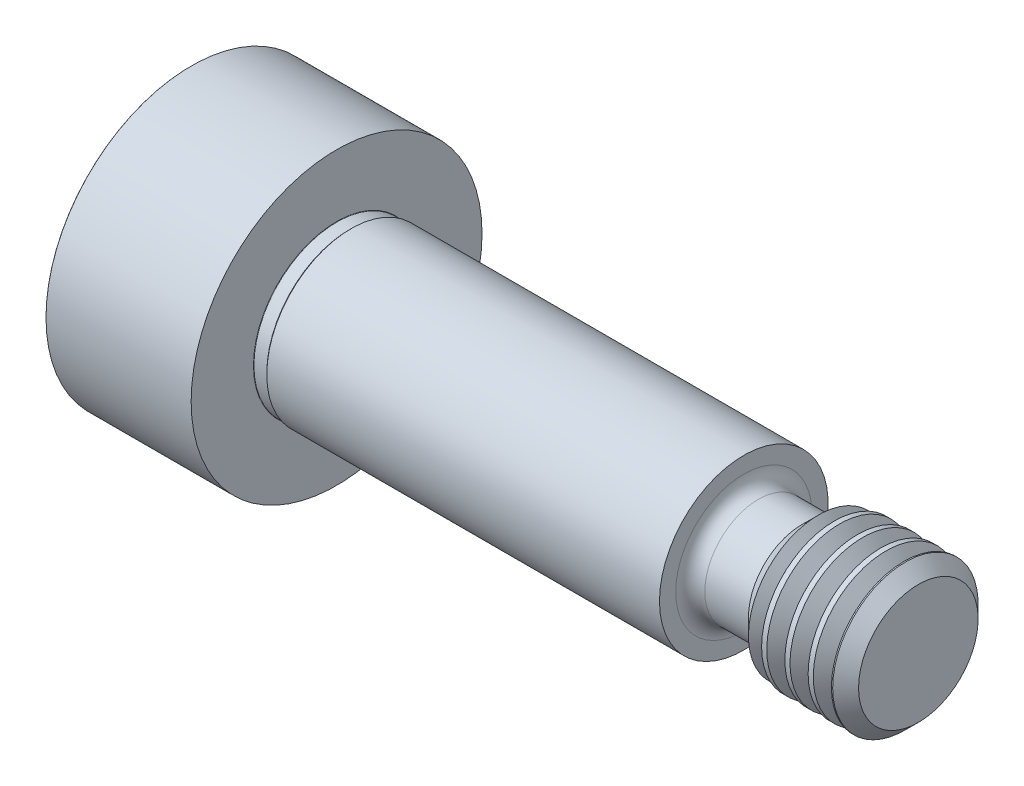
ISO-10303-21;
HEADER;
FILE_DESCRIPTION(('STEP AP214'),'2;1');
FILE_NAME('part.step','',(''),(''),'','','');
FILE_SCHEMA(('AUTOMOTIVE_DESIGN { 1 0 10303 214 1 1 1 1 }'));
ENDSEC;
DATA;
#1=APPLICATION_CONTEXT('core data for automotive mechanical design processes');
#2=APPLICATION_PROTOCOL_DEFINITION('international standard','automotive_design',2000,#1);
#3=PRODUCT_CONTEXT('',#1,'mechanical');
#4=PRODUCT('Part','Part','',(#3));
#5=PRODUCT_RELATED_PRODUCT_CATEGORY('part','',(#4));
#6=PRODUCT_DEFINITION_FORMATION('','',#4);
#7=PRODUCT_DEFINITION_CONTEXT('part definition',#1,'design');
#8=PRODUCT_DEFINITION('design','',#6,#7);
#9=PRODUCT_DEFINITION_SHAPE('','',#8);
#10=(LENGTH_UNIT() NAMED_UNIT(*) SI_UNIT(.MILLI.,.METRE.));
#11=(NAMED_UNIT(*) PLANE_ANGLE_UNIT() SI_UNIT($,.RADIAN.));
#12=(NAMED_UNIT(*) SI_UNIT($,.STERADIAN.) SOLID_ANGLE_UNIT());
#13=UNCERTAINTY_MEASURE_WITH_UNIT(LENGTH_MEASURE(1.E-05),#10,'distance_accuracy_value','');
#14=(GEOMETRIC_REPRESENTATION_CONTEXT(3) GLOBAL_UNCERTAINTY_ASSIGNED_CONTEXT((#13)) GLOBAL_UNIT_ASSIGNED_CONTEXT((#10,
#11,#12)) REPRESENTATION_CONTEXT('',''));
#15=CARTESIAN_POINT('',(0.,0.,0.));
#16=DIRECTION('',(0.,0.,1.));
#17=DIRECTION('',(1.,0.,0.));
#18=AXIS2_PLACEMENT_3D('',#15,#16,#17);
#19=CARTESIAN_POINT('',(0.,0.,0.));
#20=DIRECTION('',(-1.,0.,0.));
#21=DIRECTION('',(0.,0.,1.));
#22=AXIS2_PLACEMENT_3D('',#19,#20,#21);
#23=PLANE('',#22);
#24=CARTESIAN_POINT('',(0.,0.,0.));
#25=DIRECTION('',(-1.,0.,0.));
#26=DIRECTION('',(0.,0.,1.));
#27=AXIS2_PLACEMENT_3D('',#24,#25,#26);
#28=CIRCLE('',#27,4.99);
#29=CARTESIAN_POINT('',(0.,0.,4.99));
#30=VERTEX_POINT('',#29);
#31=EDGE_CURVE('E42',#30,#30,#28,.T.);
#32=ORIENTED_EDGE('',*,*,#31,.T.);
#33=EDGE_LOOP('',(#32));
#34=FACE_BOUND('',#33,.T.);
#35=DIRECTION('',(0.,-0.5,-0.866025403784439));
#36=VECTOR('',#35,1.);
#37=CARTESIAN_POINT('',(0.,-0.889119414552024,1.54));
#38=LINE('',#37,#36);
#39=CARTESIAN_POINT('',(0.,-0.889119414552024,1.54));
#40=VERTEX_POINT('',#39);
#41=CARTESIAN_POINT('',(0.,-1.77823882910405,0.));
#42=VERTEX_POINT('',#41);
#43=EDGE_CURVE('E50',#40,#42,#38,.T.);
#44=ORIENTED_EDGE('',*,*,#43,.T.);
#45=DIRECTION('',(0.,0.5,-0.866025403784439));
#46=VECTOR('',#45,1.);
#47=CARTESIAN_POINT('',(0.,-1.77823882910405,0.));
#48=LINE('',#47,#46);
#49=CARTESIAN_POINT('',(0.,-0.889119414552024,-1.54));
#50=VERTEX_POINT('',#49);
#51=EDGE_CURVE('E186',#42,#50,#48,.T.);
#52=ORIENTED_EDGE('',*,*,#51,.T.);
#53=DIRECTION('',(0.,1.,0.));
#54=VECTOR('',#53,1.);
#55=CARTESIAN_POINT('',(0.,-0.889119414552024,-1.54));
#56=LINE('',#55,#54);
#57=CARTESIAN_POINT('',(0.,0.889119414552017,-1.54));
#58=VERTEX_POINT('',#57);
#59=EDGE_CURVE('E130',#50,#58,#56,.T.);
#60=ORIENTED_EDGE('',*,*,#59,.T.);
#61=DIRECTION('',(0.,0.500000000000004,0.866025403784436));
#62=VECTOR('',#61,1.);
#63=CARTESIAN_POINT('',(0.,0.889119414552017,-1.54));
#64=LINE('',#63,#62);
#65=CARTESIAN_POINT('',(0.,1.77823882910405,0.));
#66=VERTEX_POINT('',#65);
#67=EDGE_CURVE('E235',#58,#66,#64,.T.);
#68=ORIENTED_EDGE('',*,*,#67,.T.);
#69=DIRECTION('',(0.,-0.500000000000004,0.866025403784436));
#70=VECTOR('',#69,1.);
#71=CARTESIAN_POINT('',(0.,1.77823882910405,0.));
#72=LINE('',#71,#70);
#73=CARTESIAN_POINT('',(0.,0.889119414552018,1.54));
#74=VERTEX_POINT('',#73);
#75=EDGE_CURVE('E237',#66,#74,#72,.T.);
#76=ORIENTED_EDGE('',*,*,#75,.T.);
#77=DIRECTION('',(0.,-1.,0.));
#78=VECTOR('',#77,1.);
#79=CARTESIAN_POINT('',(0.,0.889119414552018,1.54));
#80=LINE('',#79,#78);
#81=EDGE_CURVE('E239',#74,#40,#80,.T.);
#82=ORIENTED_EDGE('',*,*,#81,.T.);
#83=EDGE_LOOP('',(#44,#52,#60,#68,#76,#82));
#84=FACE_BOUND('',#83,.T.);
#85=ADVANCED_FACE('F33',(#34,#84),#23,.T.);
#86=CARTESIAN_POINT('',(-6.34999999999999,0.,0.));
#87=DIRECTION('',(-1.,0.,0.));
#88=DIRECTION('',(0.,0.,1.));
#89=AXIS2_PLACEMENT_3D('',#86,#87,#88);
#90=CYLINDRICAL_SURFACE('',#89,5.);
#91=CARTESIAN_POINT('',(0.00999999999999873,0.,0.));
#92=DIRECTION('',(-1.,0.,0.));
#93=DIRECTION('',(0.,0.,1.));
#94=AXIS2_PLACEMENT_3D('',#91,#92,#93);
#95=CIRCLE('',#94,5.);
#96=CARTESIAN_POINT('',(0.00999999999999873,0.,5.));
#97=VERTEX_POINT('',#96);
#98=EDGE_CURVE('E11',#97,#97,#95,.F.);
#99=ORIENTED_EDGE('',*,*,#98,.T.);
#100=EDGE_LOOP('',(#99));
#101=FACE_BOUND('',#100,.T.);
#102=CARTESIAN_POINT('',(5.,0.,0.));
#103=DIRECTION('',(-1.,0.,0.));
#104=DIRECTION('',(0.,0.,1.));
#105=AXIS2_PLACEMENT_3D('',#102,#103,#104);
#106=CIRCLE('',#105,5.);
#107=CARTESIAN_POINT('',(5.,0.,5.));
#108=VERTEX_POINT('',#107);
#109=EDGE_CURVE('E174',#108,#108,#106,.T.);
#110=ORIENTED_EDGE('',*,*,#109,.T.);
#111=EDGE_LOOP('',(#110));
#112=FACE_BOUND('',#111,.T.);
#113=ADVANCED_FACE('F298',(#101,#112),#90,.T.);
#114=CARTESIAN_POINT('',(5.,5.,0.));
#115=DIRECTION('',(1.,0.,0.));
#116=DIRECTION('',(0.,0.,-1.));
#117=AXIS2_PLACEMENT_3D('',#114,#115,#116);
#118=PLANE('',#117);
#119=CARTESIAN_POINT('',(5.,0.,0.));
#120=DIRECTION('',(-1.,0.,0.));
#121=DIRECTION('',(0.,0.,1.));
#122=AXIS2_PLACEMENT_3D('',#119,#120,#121);
#123=CIRCLE('',#122,2.86);
#124=CARTESIAN_POINT('',(5.,0.,2.86));
#125=VERTEX_POINT('',#124);
#126=EDGE_CURVE('E171',#125,#125,#123,.T.);
#127=ORIENTED_EDGE('',*,*,#126,.T.);
#128=EDGE_LOOP('',(#127));
#129=FACE_BOUND('',#128,.T.);
#130=ORIENTED_EDGE('',*,*,#109,.F.);
#131=EDGE_LOOP('',(#130));
#132=FACE_BOUND('',#131,.T.);
#133=ADVANCED_FACE('F303',(#129,#132),#118,.T.);
#134=CARTESIAN_POINT('',(5.01,0.,0.));
#135=DIRECTION('',(-1.,0.,0.));
#136=DIRECTION('',(0.,0.,1.));
#137=AXIS2_PLACEMENT_3D('',#134,#135,#136);
#138=TOROIDAL_SURFACE('',#137,2.86,0.01);
#139=ORIENTED_EDGE('',*,*,#126,.F.);
#140=EDGE_LOOP('',(#139));
#141=FACE_BOUND('',#140,.T.);
#142=CARTESIAN_POINT('',(5.01,0.,0.));
#143=DIRECTION('',(-1.,0.,0.));
#144=DIRECTION('',(0.,0.,1.));
#145=AXIS2_PLACEMENT_3D('',#142,#143,#144);
#146=CIRCLE('',#145,2.85);
#147=CARTESIAN_POINT('',(5.01,0.,2.85));
#148=VERTEX_POINT('',#147);
#149=EDGE_CURVE('E168',#148,#148,#146,.T.);
#150=ORIENTED_EDGE('',*,*,#149,.T.);
#151=EDGE_LOOP('',(#150));
#152=FACE_BOUND('',#151,.T.);
#153=ADVANCED_FACE('F309',(#141,#152),#138,.F.);
#154=CARTESIAN_POINT('',(-6.34999999999999,0.,0.));
#155=DIRECTION('',(-1.,0.,0.));
#156=DIRECTION('',(0.,0.,1.));
#157=AXIS2_PLACEMENT_3D('',#154,#155,#156);
#158=CYLINDRICAL_SURFACE('',#157,2.85);
#159=CARTESIAN_POINT('',(5.45,0.,0.));
#160=DIRECTION('',(-1.,0.,0.));
#161=DIRECTION('',(0.,0.,1.));
#162=AXIS2_PLACEMENT_3D('',#159,#160,#161);
#163=CIRCLE('',#162,2.85);
#164=CARTESIAN_POINT('',(5.45,0.,2.85));
#165=VERTEX_POINT('',#164);
#166=EDGE_CURVE('E165',#165,#165,#163,.T.);
#167=ORIENTED_EDGE('',*,*,#166,.T.);
#168=EDGE_LOOP('',(#167));
#169=FACE_BOUND('',#168,.T.);
#170=ORIENTED_EDGE('',*,*,#149,.F.);
#171=EDGE_LOOP('',(#170));
#172=FACE_BOUND('',#171,.T.);
#173=ADVANCED_FACE('F313',(#169,#172),#158,.T.);
#174=CARTESIAN_POINT('',(5.45,0.,0.));
#175=DIRECTION('',(1.,0.,0.));
#176=DIRECTION('',(0.,0.,-1.));
#177=AXIS2_PLACEMENT_3D('',#174,#175,#176);
#178=CONICAL_SURFACE('',#177,2.85,0.785398163397448);
#179=CARTESIAN_POINT('',(5.5,0.,0.));
#180=DIRECTION('',(-1.,0.,0.));
#181=DIRECTION('',(0.,0.,1.));
#182=AXIS2_PLACEMENT_3D('',#179,#180,#181);
#183=CIRCLE('',#182,2.9);
#184=CARTESIAN_POINT('',(5.5,0.,2.9));
#185=VERTEX_POINT('',#184);
#186=EDGE_CURVE('E162',#185,#185,#183,.T.);
#187=ORIENTED_EDGE('',*,*,#186,.T.);
#188=EDGE_LOOP('',(#187));
#189=FACE_BOUND('',#188,.T.);
#190=ORIENTED_EDGE('',*,*,#166,.F.);
#191=EDGE_LOOP('',(#190));
#192=FACE_BOUND('',#191,.T.);
#193=ADVANCED_FACE('F317',(#189,#192),#178,.T.);
#194=CARTESIAN_POINT('',(-6.34999999999999,0.,0.));
#195=DIRECTION('',(-1.,0.,0.));
#196=DIRECTION('',(0.,0.,1.));
#197=AXIS2_PLACEMENT_3D('',#194,#195,#196);
#198=CYLINDRICAL_SURFACE('',#197,2.9);
#199=CARTESIAN_POINT('',(19.,0.,0.));
#200=DIRECTION('',(-1.,0.,0.));
#201=DIRECTION('',(0.,0.,1.));
#202=AXIS2_PLACEMENT_3D('',#199,#200,#201);
#203=CIRCLE('',#202,2.9);
#204=CARTESIAN_POINT('',(19.,0.,2.9));
#205=VERTEX_POINT('',#204);
#206=EDGE_CURVE('E159',#205,#205,#203,.T.);
#207=ORIENTED_EDGE('',*,*,#206,.T.);
#208=EDGE_LOOP('',(#207));
#209=FACE_BOUND('',#208,.T.);
#210=ORIENTED_EDGE('',*,*,#186,.F.);
#211=EDGE_LOOP('',(#210));
#212=FACE_BOUND('',#211,.T.);
#213=ADVANCED_FACE('F321',(#209,#212),#198,.T.);
#214=CARTESIAN_POINT('',(19.,2.9,0.));
#215=DIRECTION('',(1.,0.,0.));
#216=DIRECTION('',(0.,0.,-1.));
#217=AXIS2_PLACEMENT_3D('',#214,#215,#216);
#218=PLANE('',#217);
#219=CARTESIAN_POINT('',(19.,0.,0.));
#220=DIRECTION('',(-1.,0.,0.));
#221=DIRECTION('',(0.,0.,1.));
#222=AXIS2_PLACEMENT_3D('',#219,#220,#221);
#223=CIRCLE('',#222,2.34);
#224=CARTESIAN_POINT('',(19.,0.,2.34));
#225=VERTEX_POINT('',#224);
#226=EDGE_CURVE('E156',#225,#225,#223,.T.);
#227=ORIENTED_EDGE('',*,*,#226,.T.);
#228=EDGE_LOOP('',(#227));
#229=FACE_BOUND('',#228,.T.);
#230=ORIENTED_EDGE('',*,*,#206,.F.);
#231=EDGE_LOOP('',(#230));
#232=FACE_BOUND('',#231,.T.);
#233=ADVANCED_FACE('F325',(#229,#232),#218,.T.);
#234=CARTESIAN_POINT('',(19.5,0.,0.));
#235=DIRECTION('',(-1.,0.,0.));
#236=DIRECTION('',(0.,0.,1.));
#237=AXIS2_PLACEMENT_3D('',#234,#235,#236);
#238=TOROIDAL_SURFACE('',#237,2.34,0.500000000000002);
#239=CARTESIAN_POINT('',(19.5,0.,0.));
#240=DIRECTION('',(-1.,0.,0.));
#241=DIRECTION('',(0.,0.,1.));
#242=AXIS2_PLACEMENT_3D('',#239,#240,#241);
#243=CIRCLE('',#242,1.84);
#244=CARTESIAN_POINT('',(19.5,0.,1.84));
#245=VERTEX_POINT('',#244);
#246=EDGE_CURVE('E153',#245,#245,#243,.T.);
#247=ORIENTED_EDGE('',*,*,#246,.T.);
#248=EDGE_LOOP('',(#247));
#249=FACE_BOUND('',#248,.T.);
#250=ORIENTED_EDGE('',*,*,#226,.F.);
#251=EDGE_LOOP('',(#250));
#252=FACE_BOUND('',#251,.T.);
#253=ADVANCED_FACE('F329',(#249,#252),#238,.F.);
#254=CARTESIAN_POINT('',(-6.34999999999999,0.,0.));
#255=DIRECTION('',(-1.,0.,0.));
#256=DIRECTION('',(0.,0.,1.));
#257=AXIS2_PLACEMENT_3D('',#254,#255,#256);
#258=CYLINDRICAL_SURFACE('',#257,1.84);
#259=CARTESIAN_POINT('',(21.,0.,0.));
#260=DIRECTION('',(-1.,0.,0.));
#261=DIRECTION('',(0.,0.,1.));
#262=AXIS2_PLACEMENT_3D('',#259,#260,#261);
#263=CIRCLE('',#262,1.84);
#264=CARTESIAN_POINT('',(21.,0.,1.84));
#265=VERTEX_POINT('',#264);
#266=EDGE_CURVE('E150',#265,#265,#263,.T.);
#267=ORIENTED_EDGE('',*,*,#266,.T.);
#268=EDGE_LOOP('',(#267));
#269=FACE_BOUND('',#268,.T.);
#270=ORIENTED_EDGE('',*,*,#246,.F.);
#271=EDGE_LOOP('',(#270));
#272=FACE_BOUND('',#271,.T.);
#273=ADVANCED_FACE('F333',(#269,#272),#258,.T.);
#274=CARTESIAN_POINT('',(21.,0.,0.));
#275=DIRECTION('',(1.,0.,0.));
#276=DIRECTION('',(0.,0.,-1.));
#277=AXIS2_PLACEMENT_3D('',#274,#275,#276);
#278=CONICAL_SURFACE('',#277,1.84,0.785398163397448);
#279=CARTESIAN_POINT('',(21.5590756418572,0.,0.));
#280=DIRECTION('',(-1.,0.,0.));
#281=DIRECTION('',(0.,-1.,0.));
#282=AXIS2_PLACEMENT_3D('',#279,#280,#281);
#283=CIRCLE('',#282,2.39907564185722);
#284=CARTESIAN_POINT('',(21.5590756418572,-2.39907564185722,0.));
#285=VERTEX_POINT('',#284);
#286=EDGE_CURVE('E182',#285,#285,#283,.F.);
#287=ORIENTED_EDGE('',*,*,#286,.F.);
#288=EDGE_LOOP('',(#287));
#289=FACE_BOUND('',#288,.T.);
#290=ORIENTED_EDGE('',*,*,#266,.F.);
#291=EDGE_LOOP('',(#290));
#292=FACE_BOUND('',#291,.T.);
#293=ADVANCED_FACE('F337',(#289,#292),#278,.T.);
#294=CARTESIAN_POINT('',(0.,0.,0.));
#295=DIRECTION('',(1.,0.,0.));
#296=DIRECTION('',(0.,0.,-1.));
#297=AXIS2_PLACEMENT_3D('',#294,#295,#296);
#298=CONICAL_SURFACE('',#297,4.99,0.785398163397492);
#299=ORIENTED_EDGE('',*,*,#98,.F.);
#300=EDGE_LOOP('',(#299));
#301=FACE_BOUND('',#300,.T.);
#302=ORIENTED_EDGE('',*,*,#31,.F.);
#303=EDGE_LOOP('',(#302));
#304=FACE_BOUND('',#303,.T.);
#305=ADVANCED_FACE('F35',(#301,#304),#298,.T.);
#306=CARTESIAN_POINT('',(2.4,-1.77823882910405,0.));
#307=DIRECTION('',(0.,0.866025403784439,0.5));
#308=DIRECTION('',(0.,-0.5,0.866025403784439));
#309=AXIS2_PLACEMENT_3D('',#306,#307,#308);
#310=PLANE('',#309);
#311=DIRECTION('',(0.,0.5,-0.866025403784439));
#312=VECTOR('',#311,1.);
#313=CARTESIAN_POINT('',(2.4,-1.77823882910405,0.));
#314=LINE('',#313,#312);
#315=CARTESIAN_POINT('',(2.4,-1.77823882910405,0.));
#316=VERTEX_POINT('',#315);
#317=CARTESIAN_POINT('',(2.4,-1.33367912182803,-0.769999999999998));
#318=VERTEX_POINT('',#317);
#319=EDGE_CURVE('E58',#316,#318,#314,.T.);
#320=ORIENTED_EDGE('',*,*,#319,.T.);
#321=CARTESIAN_POINT('',(2.4,-0.889119414552024,-1.54));
#322=VERTEX_POINT('',#321);
#323=EDGE_CURVE('E108',#318,#322,#314,.T.);
#324=ORIENTED_EDGE('',*,*,#323,.T.);
#325=DIRECTION('',(-1.,0.,0.));
#326=VECTOR('',#325,1.);
#327=CARTESIAN_POINT('',(2.4,-0.889119414552024,-1.54));
#328=LINE('',#327,#326);
#329=EDGE_CURVE('E112',#322,#50,#328,.T.);
#330=ORIENTED_EDGE('',*,*,#329,.T.);
#331=ORIENTED_EDGE('',*,*,#51,.F.);
#332=DIRECTION('',(-1.,0.,0.));
#333=VECTOR('',#332,1.);
#334=CARTESIAN_POINT('',(2.4,-1.77823882910405,0.));
#335=LINE('',#334,#333);
#336=EDGE_CURVE('E232',#316,#42,#335,.T.);
#337=ORIENTED_EDGE('',*,*,#336,.F.);
#338=EDGE_LOOP('',(#320,#324,#330,#331,#337));
#339=FACE_BOUND('',#338,.T.);
#340=ADVANCED_FACE('F110',(#339),#310,.T.);
#341=CARTESIAN_POINT('',(2.4,-0.889119414552024,-1.54));
#342=DIRECTION('',(0.,0.,1.));
#343=DIRECTION('',(0.,-1.,0.));
#344=AXIS2_PLACEMENT_3D('',#341,#342,#343);
#345=PLANE('',#344);
#346=DIRECTION('',(0.,1.,0.));
#347=VECTOR('',#346,1.);
#348=CARTESIAN_POINT('',(2.4,-0.889119414552024,-1.54));
#349=LINE('',#348,#347);
#350=CARTESIAN_POINT('',(2.4,0.,-1.54));
#351=VERTEX_POINT('',#350);
#352=EDGE_CURVE('E117',#322,#351,#349,.T.);
#353=ORIENTED_EDGE('',*,*,#352,.T.);
#354=CARTESIAN_POINT('',(2.4,0.889119414552017,-1.54));
#355=VERTEX_POINT('',#354);
#356=EDGE_CURVE('E125',#351,#355,#349,.T.);
#357=ORIENTED_EDGE('',*,*,#356,.T.);
#358=DIRECTION('',(-1.,0.,0.));
#359=VECTOR('',#358,1.);
#360=CARTESIAN_POINT('',(2.4,0.889119414552017,-1.54));
#361=LINE('',#360,#359);
#362=EDGE_CURVE('E132',#355,#58,#361,.T.);
#363=ORIENTED_EDGE('',*,*,#362,.T.);
#364=ORIENTED_EDGE('',*,*,#59,.F.);
#365=ORIENTED_EDGE('',*,*,#329,.F.);
#366=EDGE_LOOP('',(#353,#357,#363,#364,#365));
#367=FACE_BOUND('',#366,.T.);
#368=ADVANCED_FACE('F128',(#367),#345,.T.);
#369=CARTESIAN_POINT('',(2.4,0.889119414552017,-1.54));
#370=DIRECTION('',(0.,-0.866025403784436,0.500000000000004));
#371=DIRECTION('',(0.,-0.500000000000004,-0.866025403784437));
#372=AXIS2_PLACEMENT_3D('',#369,#370,#371);
#373=PLANE('',#372);
#374=DIRECTION('',(0.,0.500000000000004,0.866025403784436));
#375=VECTOR('',#374,1.);
#376=CARTESIAN_POINT('',(2.4,0.889119414552017,-1.54));
#377=LINE('',#376,#375);
#378=CARTESIAN_POINT('',(2.4,1.33367912182803,-0.770000000000004));
#379=VERTEX_POINT('',#378);
#380=EDGE_CURVE('E217',#355,#379,#377,.T.);
#381=ORIENTED_EDGE('',*,*,#380,.T.);
#382=CARTESIAN_POINT('',(2.4,1.77823882910405,0.));
#383=VERTEX_POINT('',#382);
#384=EDGE_CURVE('E124',#379,#383,#377,.T.);
#385=ORIENTED_EDGE('',*,*,#384,.T.);
#386=DIRECTION('',(-1.,0.,0.));
#387=VECTOR('',#386,1.);
#388=CARTESIAN_POINT('',(2.4,1.77823882910405,0.));
#389=LINE('',#388,#387);
#390=EDGE_CURVE('E138',#383,#66,#389,.T.);
#391=ORIENTED_EDGE('',*,*,#390,.T.);
#392=ORIENTED_EDGE('',*,*,#67,.F.);
#393=ORIENTED_EDGE('',*,*,#362,.F.);
#394=EDGE_LOOP('',(#381,#385,#391,#392,#393));
#395=FACE_BOUND('',#394,.T.);
#396=ADVANCED_FACE('F254',(#395),#373,.T.);
#397=CARTESIAN_POINT('',(2.4,1.77823882910405,0.));
#398=DIRECTION('',(0.,-0.866025403784437,-0.500000000000004));
#399=DIRECTION('',(0.,0.500000000000004,-0.866025403784436));
#400=AXIS2_PLACEMENT_3D('',#397,#398,#399);
#401=PLANE('',#400);
#402=DIRECTION('',(0.,-0.500000000000004,0.866025403784436));
#403=VECTOR('',#402,1.);
#404=CARTESIAN_POINT('',(2.4,1.77823882910405,0.));
#405=LINE('',#404,#403);
#406=CARTESIAN_POINT('',(2.4,1.33367912182803,0.770000000000004));
#407=VERTEX_POINT('',#406);
#408=EDGE_CURVE('E221',#383,#407,#405,.T.);
#409=ORIENTED_EDGE('',*,*,#408,.T.);
#410=CARTESIAN_POINT('',(2.4,0.889119414552018,1.54));
#411=VERTEX_POINT('',#410);
#412=EDGE_CURVE('E220',#407,#411,#405,.T.);
#413=ORIENTED_EDGE('',*,*,#412,.T.);
#414=DIRECTION('',(-1.,0.,0.));
#415=VECTOR('',#414,1.);
#416=CARTESIAN_POINT('',(2.4,0.889119414552018,1.54));
#417=LINE('',#416,#415);
#418=EDGE_CURVE('E247',#411,#74,#417,.T.);
#419=ORIENTED_EDGE('',*,*,#418,.T.);
#420=ORIENTED_EDGE('',*,*,#75,.F.);
#421=ORIENTED_EDGE('',*,*,#390,.F.);
#422=EDGE_LOOP('',(#409,#413,#419,#420,#421));
#423=FACE_BOUND('',#422,.T.);
#424=ADVANCED_FACE('F259',(#423),#401,.T.);
#425=CARTESIAN_POINT('',(2.4,0.889119414552018,1.54));
#426=DIRECTION('',(0.,0.,-1.));
#427=DIRECTION('',(0.,1.,0.));
#428=AXIS2_PLACEMENT_3D('',#425,#426,#427);
#429=PLANE('',#428);
#430=DIRECTION('',(0.,-1.,0.));
#431=VECTOR('',#430,1.);
#432=CARTESIAN_POINT('',(2.4,0.889119414552018,1.54));
#433=LINE('',#432,#431);
#434=CARTESIAN_POINT('',(2.4,0.,1.54));
#435=VERTEX_POINT('',#434);
#436=EDGE_CURVE('E225',#411,#435,#433,.T.);
#437=ORIENTED_EDGE('',*,*,#436,.T.);
#438=CARTESIAN_POINT('',(2.4,-0.889119414552024,1.54));
#439=VERTEX_POINT('',#438);
#440=EDGE_CURVE('E224',#435,#439,#433,.T.);
#441=ORIENTED_EDGE('',*,*,#440,.T.);
#442=DIRECTION('',(-1.,0.,0.));
#443=VECTOR('',#442,1.);
#444=CARTESIAN_POINT('',(2.4,-0.889119414552024,1.54));
#445=LINE('',#444,#443);
#446=EDGE_CURVE('E244',#439,#40,#445,.T.);
#447=ORIENTED_EDGE('',*,*,#446,.T.);
#448=ORIENTED_EDGE('',*,*,#81,.F.);
#449=ORIENTED_EDGE('',*,*,#418,.F.);
#450=EDGE_LOOP('',(#437,#441,#447,#448,#449));
#451=FACE_BOUND('',#450,.T.);
#452=ADVANCED_FACE('F284',(#451),#429,.T.);
#453=CARTESIAN_POINT('',(2.4,-0.889119414552024,1.54));
#454=DIRECTION('',(0.,0.866025403784439,-0.5));
#455=DIRECTION('',(0.,0.5,0.866025403784439));
#456=AXIS2_PLACEMENT_3D('',#453,#454,#455);
#457=PLANE('',#456);
#458=DIRECTION('',(0.,-0.5,-0.866025403784439));
#459=VECTOR('',#458,1.);
#460=CARTESIAN_POINT('',(2.4,-0.889119414552024,1.54));
#461=LINE('',#460,#459);
#462=CARTESIAN_POINT('',(2.4,-1.33367912182804,0.77));
#463=VERTEX_POINT('',#462);
#464=EDGE_CURVE('E229',#439,#463,#461,.T.);
#465=ORIENTED_EDGE('',*,*,#464,.T.);
#466=EDGE_CURVE('E228',#463,#316,#461,.T.);
#467=ORIENTED_EDGE('',*,*,#466,.T.);
#468=ORIENTED_EDGE('',*,*,#336,.T.);
#469=ORIENTED_EDGE('',*,*,#43,.F.);
#470=ORIENTED_EDGE('',*,*,#446,.F.);
#471=EDGE_LOOP('',(#465,#467,#468,#469,#470));
#472=FACE_BOUND('',#471,.T.);
#473=ADVANCED_FACE('F286',(#472),#457,.T.);
#474=CARTESIAN_POINT('',(2.4,0.,-3.07999999999999));
#475=DIRECTION('',(1.,0.,0.));
#476=DIRECTION('',(0.,0.,-1.));
#477=AXIS2_PLACEMENT_3D('',#474,#475,#476);
#478=PLANE('',#477);
#479=CARTESIAN_POINT('',(2.4,0.,0.));
#480=DIRECTION('',(-1.,0.,0.));
#481=DIRECTION('',(0.,0.,1.));
#482=AXIS2_PLACEMENT_3D('',#479,#480,#481);
#483=CIRCLE('',#482,1.54);
#484=EDGE_CURVE('E266',#379,#351,#483,.T.);
#485=ORIENTED_EDGE('',*,*,#484,.F.);
#486=ORIENTED_EDGE('',*,*,#380,.F.);
#487=ORIENTED_EDGE('',*,*,#356,.F.);
#488=EDGE_LOOP('',(#485,#486,#487));
#489=FACE_BOUND('',#488,.T.);
#490=ADVANCED_FACE('F265',(#489),#478,.F.);
#491=EDGE_CURVE('E144',#407,#379,#483,.T.);
#492=ORIENTED_EDGE('',*,*,#491,.F.);
#493=ORIENTED_EDGE('',*,*,#408,.F.);
#494=ORIENTED_EDGE('',*,*,#384,.F.);
#495=EDGE_LOOP('',(#492,#493,#494));
#496=FACE_BOUND('',#495,.T.);
#497=ADVANCED_FACE('F269',(#496),#478,.F.);
#498=EDGE_CURVE('E137',#435,#407,#483,.T.);
#499=ORIENTED_EDGE('',*,*,#498,.F.);
#500=ORIENTED_EDGE('',*,*,#436,.F.);
#501=ORIENTED_EDGE('',*,*,#412,.F.);
#502=EDGE_LOOP('',(#499,#500,#501));
#503=FACE_BOUND('',#502,.T.);
#504=ADVANCED_FACE('F277',(#503),#478,.F.);
#505=EDGE_CURVE('E131',#463,#435,#483,.T.);
#506=ORIENTED_EDGE('',*,*,#505,.F.);
#507=ORIENTED_EDGE('',*,*,#464,.F.);
#508=ORIENTED_EDGE('',*,*,#440,.F.);
#509=EDGE_LOOP('',(#506,#507,#508));
#510=FACE_BOUND('',#509,.T.);
#511=ADVANCED_FACE('F280',(#510),#478,.F.);
#512=EDGE_CURVE('E135',#318,#463,#483,.T.);
#513=ORIENTED_EDGE('',*,*,#512,.F.);
#514=ORIENTED_EDGE('',*,*,#319,.F.);
#515=ORIENTED_EDGE('',*,*,#466,.F.);
#516=EDGE_LOOP('',(#513,#514,#515));
#517=FACE_BOUND('',#516,.T.);
#518=ADVANCED_FACE('F288',(#517),#478,.F.);
#519=EDGE_CURVE('E120',#351,#318,#483,.T.);
#520=ORIENTED_EDGE('',*,*,#519,.F.);
#521=ORIENTED_EDGE('',*,*,#352,.F.);
#522=ORIENTED_EDGE('',*,*,#323,.F.);
#523=EDGE_LOOP('',(#520,#521,#522));
#524=FACE_BOUND('',#523,.T.);
#525=ADVANCED_FACE('F118',(#524),#478,.F.);
#526=CARTESIAN_POINT('',(3.28911941455203,0.,0.));
#527=DIRECTION('',(-1.,0.,0.));
#528=DIRECTION('',(0.,0.,1.));
#529=AXIS2_PLACEMENT_3D('',#526,#527,#528);
#530=CONICAL_SURFACE('',#529,0.,1.04719755119659);
#531=ORIENTED_EDGE('',*,*,#498,.T.);
#532=ORIENTED_EDGE('',*,*,#491,.T.);
#533=ORIENTED_EDGE('',*,*,#484,.T.);
#534=ORIENTED_EDGE('',*,*,#519,.T.);
#535=ORIENTED_EDGE('',*,*,#512,.T.);
#536=ORIENTED_EDGE('',*,*,#505,.T.);
#537=EDGE_LOOP('',(#531,#532,#533,#534,#535,#536));
#538=FACE_BOUND('',#537,.T.);
#539=CARTESIAN_POINT('',(3.28911941455203,0.,0.));
#540=VERTEX_POINT('',#539);
#541=VERTEX_LOOP('',#540);
#542=FACE_BOUND('',#541,.T.);
#543=ADVANCED_FACE('F271',(#538,#542),#530,.F.);
#544=CARTESIAN_POINT('',(22.3916753697872,0.,0.));
#545=DIRECTION('',(1.,0.,0.));
#546=DIRECTION('',(0.,1.,0.));
#547=AXIS2_PLACEMENT_3D('',#544,#545,#546);
#548=CONICAL_SURFACE('',#547,2.9,0.959931088596884);
#549=CARTESIAN_POINT('',(22.1115923545033,0.,0.));
#550=DIRECTION('',(1.,0.,0.));
#551=DIRECTION('',(0.,1.,0.));
#552=AXIS2_PLACEMENT_3D('',#549,#550,#551);
#553=CIRCLE('',#552,2.5);
#554=CARTESIAN_POINT('',(22.1115923545033,2.5,0.));
#555=VERTEX_POINT('',#554);
#556=EDGE_CURVE('E179',#555,#555,#553,.F.);
#557=ORIENTED_EDGE('',*,*,#556,.T.);
#558=EDGE_LOOP('',(#557));
#559=FACE_BOUND('',#558,.T.);
#560=CARTESIAN_POINT('',(21.8,0.,0.));
#561=DIRECTION('',(-1.,0.,0.));
#562=DIRECTION('',(0.,-1.,0.));
#563=AXIS2_PLACEMENT_3D('',#560,#561,#562);
#564=CIRCLE('',#563,2.055);
#565=CARTESIAN_POINT('',(21.8,-2.055,0.));
#566=VERTEX_POINT('',#565);
#567=EDGE_CURVE('E183',#566,#566,#564,.T.);
#568=ORIENTED_EDGE('',*,*,#567,.F.);
#569=EDGE_LOOP('',(#568));
#570=FACE_BOUND('',#569,.T.);
#571=ADVANCED_FACE('F361',(#559,#570),#548,.T.);
#572=CARTESIAN_POINT('',(21.8,0.,0.));
#573=DIRECTION('',(-1.,0.,0.));
#574=DIRECTION('',(0.,-1.,0.));
#575=AXIS2_PLACEMENT_3D('',#572,#573,#574);
#576=CONICAL_SURFACE('',#575,2.055,0.959931088596873);
#577=ORIENTED_EDGE('',*,*,#286,.T.);
#578=EDGE_LOOP('',(#577));
#579=FACE_BOUND('',#578,.T.);
#580=ORIENTED_EDGE('',*,*,#567,.T.);
#581=EDGE_LOOP('',(#580));
#582=FACE_BOUND('',#581,.T.);
#583=ADVANCED_FACE('F346',(#579,#582),#576,.T.);
#584=CARTESIAN_POINT('',(-6.34999999999999,0.,0.));
#585=DIRECTION('',(-1.,0.,0.));
#586=DIRECTION('',(0.,0.,1.));
#587=AXIS2_PLACEMENT_3D('',#584,#585,#586);
#588=CYLINDRICAL_SURFACE('',#587,2.5);
#589=CARTESIAN_POINT('',(22.2884076454967,0.,0.));
#590=DIRECTION('',(-1.,0.,0.));
#591=DIRECTION('',(0.,-1.,0.));
#592=AXIS2_PLACEMENT_3D('',#589,#590,#591);
#593=CIRCLE('',#592,2.5);
#594=CARTESIAN_POINT('',(22.2884076454967,-2.5,0.));
#595=VERTEX_POINT('',#594);
#596=EDGE_CURVE('E187',#595,#595,#593,.F.);
#597=ORIENTED_EDGE('',*,*,#596,.F.);
#598=EDGE_LOOP('',(#597));
#599=FACE_BOUND('',#598,.T.);
#600=ORIENTED_EDGE('',*,*,#556,.F.);
#601=EDGE_LOOP('',(#600));
#602=FACE_BOUND('',#601,.T.);
#603=ADVANCED_FACE('F342',(#599,#602),#588,.T.);
#604=CARTESIAN_POINT('',(23.1916753697872,0.,0.));
#605=DIRECTION('',(1.,0.,0.));
#606=DIRECTION('',(0.,1.,0.));
#607=AXIS2_PLACEMENT_3D('',#604,#605,#606);
#608=CONICAL_SURFACE('',#607,2.9,0.959931088596884);
#609=CARTESIAN_POINT('',(22.9115923545033,0.,0.));
#610=DIRECTION('',(1.,0.,0.));
#611=DIRECTION('',(0.,1.,0.));
#612=AXIS2_PLACEMENT_3D('',#609,#610,#611);
#613=CIRCLE('',#612,2.5);
#614=CARTESIAN_POINT('',(22.9115923545033,2.5,0.));
#615=VERTEX_POINT('',#614);
#616=EDGE_CURVE('E190',#615,#615,#613,.F.);
#617=ORIENTED_EDGE('',*,*,#616,.T.);
#618=EDGE_LOOP('',(#617));
#619=FACE_BOUND('',#618,.T.);
#620=CARTESIAN_POINT('',(22.6,0.,0.));
#621=DIRECTION('',(-1.,0.,0.));
#622=DIRECTION('',(0.,-1.,0.));
#623=AXIS2_PLACEMENT_3D('',#620,#621,#622);
#624=CIRCLE('',#623,2.055);
#625=CARTESIAN_POINT('',(22.6,-2.055,0.));
#626=VERTEX_POINT('',#625);
#627=EDGE_CURVE('E191',#626,#626,#624,.T.);
#628=ORIENTED_EDGE('',*,*,#627,.F.);
#629=EDGE_LOOP('',(#628));
#630=FACE_BOUND('',#629,.T.);
#631=ADVANCED_FACE('F345',(#619,#630),#608,.T.);
#632=CARTESIAN_POINT('',(22.6,0.,0.));
#633=DIRECTION('',(-1.,0.,0.));
#634=DIRECTION('',(0.,-1.,0.));
#635=AXIS2_PLACEMENT_3D('',#632,#633,#634);
#636=CONICAL_SURFACE('',#635,2.055,0.959931088596873);
#637=ORIENTED_EDGE('',*,*,#596,.T.);
#638=EDGE_LOOP('',(#637));
#639=FACE_BOUND('',#638,.T.);
#640=ORIENTED_EDGE('',*,*,#627,.T.);
#641=EDGE_LOOP('',(#640));
#642=FACE_BOUND('',#641,.T.);
#643=ADVANCED_FACE('F447',(#639,#642),#636,.T.);
#644=CARTESIAN_POINT('',(23.0884076454967,0.,0.));
#645=DIRECTION('',(-1.,0.,0.));
#646=DIRECTION('',(0.,-1.,0.));
#647=AXIS2_PLACEMENT_3D('',#644,#645,#646);
#648=CIRCLE('',#647,2.5);
#649=CARTESIAN_POINT('',(23.0884076454967,-2.5,0.));
#650=VERTEX_POINT('',#649);
#651=EDGE_CURVE('E194',#650,#650,#648,.F.);
#652=ORIENTED_EDGE('',*,*,#651,.F.);
#653=EDGE_LOOP('',(#652));
#654=FACE_BOUND('',#653,.T.);
#655=ORIENTED_EDGE('',*,*,#616,.F.);
#656=EDGE_LOOP('',(#655));
#657=FACE_BOUND('',#656,.T.);
#658=ADVANCED_FACE('F349',(#654,#657),#588,.T.);
#659=CARTESIAN_POINT('',(23.9916753697872,0.,0.));
#660=DIRECTION('',(1.,0.,0.));
#661=DIRECTION('',(0.,1.,0.));
#662=AXIS2_PLACEMENT_3D('',#659,#660,#661);
#663=CONICAL_SURFACE('',#662,2.9,0.959931088596884);
#664=CARTESIAN_POINT('',(23.7115923545033,0.,0.));
#665=DIRECTION('',(1.,0.,0.));
#666=DIRECTION('',(0.,1.,0.));
#667=AXIS2_PLACEMENT_3D('',#664,#665,#666);
#668=CIRCLE('',#667,2.5);
#669=CARTESIAN_POINT('',(23.7115923545033,2.5,0.));
#670=VERTEX_POINT('',#669);
#671=EDGE_CURVE('E197',#670,#670,#668,.F.);
#672=ORIENTED_EDGE('',*,*,#671,.T.);
#673=EDGE_LOOP('',(#672));
#674=FACE_BOUND('',#673,.T.);
#675=CARTESIAN_POINT('',(23.4,0.,0.));
#676=DIRECTION('',(-1.,0.,0.));
#677=DIRECTION('',(0.,-1.,0.));
#678=AXIS2_PLACEMENT_3D('',#675,#676,#677);
#679=CIRCLE('',#678,2.055);
#680=CARTESIAN_POINT('',(23.4,-2.055,0.));
#681=VERTEX_POINT('',#680);
#682=EDGE_CURVE('E198',#681,#681,#679,.T.);
#683=ORIENTED_EDGE('',*,*,#682,.F.);
#684=EDGE_LOOP('',(#683));
#685=FACE_BOUND('',#684,.T.);
#686=ADVANCED_FACE('F467',(#674,#685),#663,.T.);
#687=CARTESIAN_POINT('',(23.4,0.,0.));
#688=DIRECTION('',(-1.,0.,0.));
#689=DIRECTION('',(0.,-1.,0.));
#690=AXIS2_PLACEMENT_3D('',#687,#688,#689);
#691=CONICAL_SURFACE('',#690,2.055,0.959931088596873);
#692=ORIENTED_EDGE('',*,*,#651,.T.);
#693=EDGE_LOOP('',(#692));
#694=FACE_BOUND('',#693,.T.);
#695=ORIENTED_EDGE('',*,*,#682,.T.);
#696=EDGE_LOOP('',(#695));
#697=FACE_BOUND('',#696,.T.);
#698=ADVANCED_FACE('F477',(#694,#697),#691,.T.);
#699=CARTESIAN_POINT('',(23.8884076454967,0.,0.));
#700=DIRECTION('',(-1.,0.,0.));
#701=DIRECTION('',(0.,-1.,0.));
#702=AXIS2_PLACEMENT_3D('',#699,#700,#701);
#703=CIRCLE('',#702,2.5);
#704=CARTESIAN_POINT('',(23.8884076454967,-2.5,0.));
#705=VERTEX_POINT('',#704);
#706=EDGE_CURVE('E200',#705,#705,#703,.F.);
#707=ORIENTED_EDGE('',*,*,#706,.F.);
#708=EDGE_LOOP('',(#707));
#709=FACE_BOUND('',#708,.T.);
#710=ORIENTED_EDGE('',*,*,#671,.F.);
#711=EDGE_LOOP('',(#710));
#712=FACE_BOUND('',#711,.T.);
#713=ADVANCED_FACE('F469',(#709,#712),#588,.T.);
#714=CARTESIAN_POINT('',(24.7916753697872,0.,0.));
#715=DIRECTION('',(1.,0.,0.));
#716=DIRECTION('',(0.,1.,0.));
#717=AXIS2_PLACEMENT_3D('',#714,#715,#716);
#718=CONICAL_SURFACE('',#717,2.9,0.959931088596884);
#719=CARTESIAN_POINT('',(24.5115923545033,0.,0.));
#720=DIRECTION('',(1.,0.,0.));
#721=DIRECTION('',(0.,1.,0.));
#722=AXIS2_PLACEMENT_3D('',#719,#720,#721);
#723=CIRCLE('',#722,2.5);
#724=CARTESIAN_POINT('',(24.5115923545033,2.5,0.));
#725=VERTEX_POINT('',#724);
#726=EDGE_CURVE('E37',#725,#725,#723,.F.);
#727=ORIENTED_EDGE('',*,*,#726,.T.);
#728=EDGE_LOOP('',(#727));
#729=FACE_BOUND('',#728,.T.);
#730=CARTESIAN_POINT('',(24.2,0.,0.));
#731=DIRECTION('',(-1.,0.,0.));
#732=DIRECTION('',(0.,-1.,0.));
#733=AXIS2_PLACEMENT_3D('',#730,#731,#732);
#734=CIRCLE('',#733,2.055);
#735=CARTESIAN_POINT('',(24.2,-2.055,0.));
#736=VERTEX_POINT('',#735);
#737=EDGE_CURVE('E202',#736,#736,#734,.T.);
#738=ORIENTED_EDGE('',*,*,#737,.F.);
#739=EDGE_LOOP('',(#738));
#740=FACE_BOUND('',#739,.T.);
#741=ADVANCED_FACE('F496',(#729,#740),#718,.T.);
#742=CARTESIAN_POINT('',(24.2,0.,0.));
#743=DIRECTION('',(-1.,0.,0.));
#744=DIRECTION('',(0.,-1.,0.));
#745=AXIS2_PLACEMENT_3D('',#742,#743,#744);
#746=CONICAL_SURFACE('',#745,2.055,0.959931088596873);
#747=ORIENTED_EDGE('',*,*,#706,.T.);
#748=EDGE_LOOP('',(#747));
#749=FACE_BOUND('',#748,.T.);
#750=ORIENTED_EDGE('',*,*,#737,.T.);
#751=EDGE_LOOP('',(#750));
#752=FACE_BOUND('',#751,.T.);
#753=ADVANCED_FACE('F357',(#749,#752),#746,.T.);
#754=CARTESIAN_POINT('',(25.,2.055,0.));
#755=DIRECTION('',(1.,0.,0.));
#756=DIRECTION('',(0.,0.,-1.));
#757=AXIS2_PLACEMENT_3D('',#754,#755,#756);
#758=PLANE('',#757);
#759=CARTESIAN_POINT('',(25.,0.,0.));
#760=DIRECTION('',(-1.,0.,0.));
#761=DIRECTION('',(0.,0.,1.));
#762=AXIS2_PLACEMENT_3D('',#759,#760,#761);
#763=CIRCLE('',#762,2.055);
#764=CARTESIAN_POINT('',(25.,0.,2.055));
#765=VERTEX_POINT('',#764);
#766=EDGE_CURVE('E143',#765,#765,#763,.T.);
#767=ORIENTED_EDGE('',*,*,#766,.F.);
#768=EDGE_LOOP('',(#767));
#769=FACE_BOUND('',#768,.T.);
#770=ADVANCED_FACE('F353',(#769),#758,.T.);
#771=CARTESIAN_POINT('',(24.555,0.,0.));
#772=DIRECTION('',(-1.,0.,0.));
#773=DIRECTION('',(0.,0.,1.));
#774=AXIS2_PLACEMENT_3D('',#771,#772,#773);
#775=CONICAL_SURFACE('',#774,2.5,0.785398163397452);
#776=ORIENTED_EDGE('',*,*,#766,.T.);
#777=EDGE_LOOP('',(#776));
#778=FACE_BOUND('',#777,.T.);
#779=CARTESIAN_POINT('',(24.555,0.,0.));
#780=DIRECTION('',(-1.,0.,0.));
#781=DIRECTION('',(0.,0.,1.));
#782=AXIS2_PLACEMENT_3D('',#779,#780,#781);
#783=CIRCLE('',#782,2.5);
#784=CARTESIAN_POINT('',(24.555,0.,2.5));
#785=VERTEX_POINT('',#784);
#786=EDGE_CURVE('E147',#785,#785,#783,.T.);
#787=ORIENTED_EDGE('',*,*,#786,.F.);
#788=EDGE_LOOP('',(#787));
#789=FACE_BOUND('',#788,.T.);
#790=ADVANCED_FACE('F350',(#778,#789),#775,.T.);
#791=ORIENTED_EDGE('',*,*,#726,.F.);
#792=EDGE_LOOP('',(#791));
#793=FACE_BOUND('',#792,.T.);
#794=ORIENTED_EDGE('',*,*,#786,.T.);
#795=EDGE_LOOP('',(#794));
#796=FACE_BOUND('',#795,.T.);
#797=ADVANCED_FACE('F348',(#793,#796),#588,.T.);
#798=CLOSED_SHELL('',(#85,#113,#133,#153,#173,#193,#213,#233,#253,#273,#293,#305,#340,#368,#396,
#424,#452,#473,#490,#497,#504,#511,#518,#525,#543,#571,#583,#603,#631,#643,#658,#686,#698,#713,
#741,#753,#770,#790,#797));
#799=MANIFOLD_SOLID_BREP('B2',#798);
#800=ADVANCED_BREP_SHAPE_REPRESENTATION('',(#18,#799),#14);
#801=SHAPE_DEFINITION_REPRESENTATION(#9,#800);
ENDSEC;
END-ISO-10303-21;
